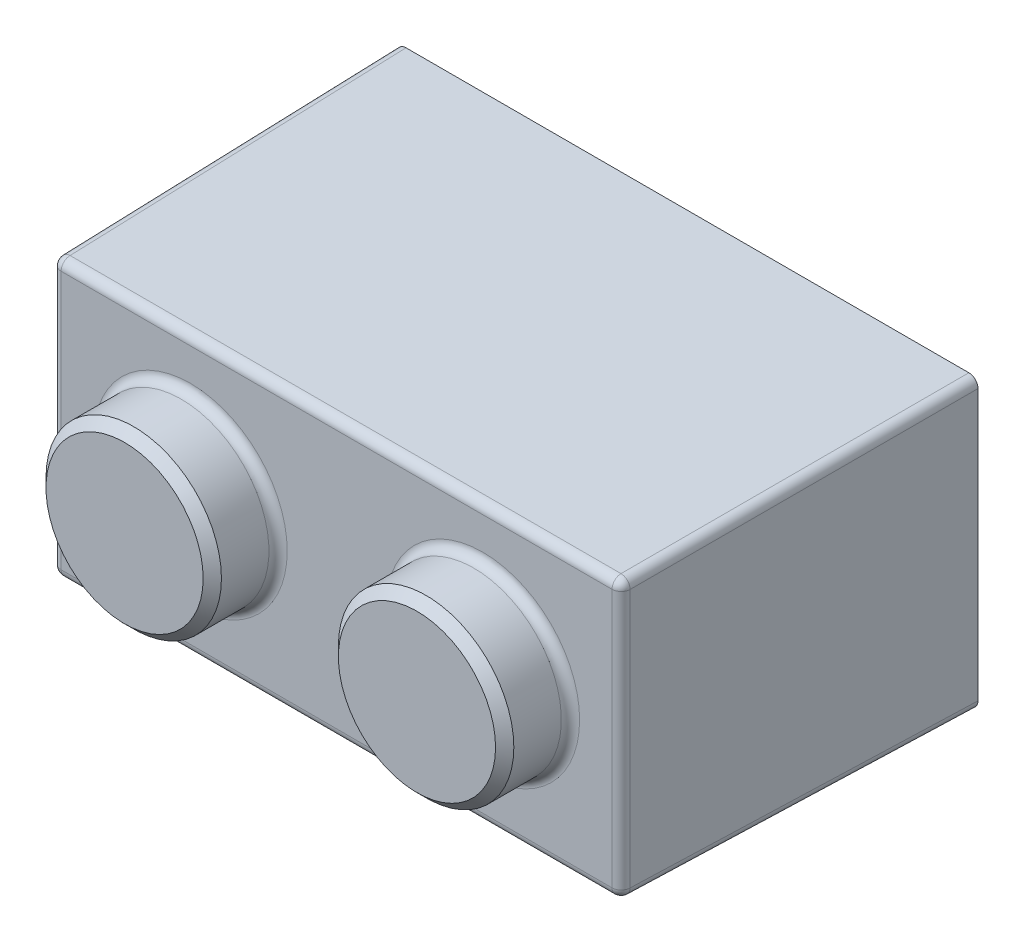
ISO-10303-21;
HEADER;
FILE_DESCRIPTION(('STEP AP214'),'2;1');
FILE_NAME('part.step','',(''),(''),'','','');
FILE_SCHEMA(('AUTOMOTIVE_DESIGN { 1 0 10303 214 1 1 1 1 }'));
ENDSEC;
DATA;
#1=APPLICATION_CONTEXT('core data for automotive mechanical design processes');
#2=APPLICATION_PROTOCOL_DEFINITION('international standard','automotive_design',2000,#1);
#3=PRODUCT_CONTEXT('',#1,'mechanical');
#4=PRODUCT('Part','Part','',(#3));
#5=PRODUCT_RELATED_PRODUCT_CATEGORY('part','',(#4));
#6=PRODUCT_DEFINITION_FORMATION('','',#4);
#7=PRODUCT_DEFINITION_CONTEXT('part definition',#1,'design');
#8=PRODUCT_DEFINITION('design','',#6,#7);
#9=PRODUCT_DEFINITION_SHAPE('','',#8);
#10=(LENGTH_UNIT() NAMED_UNIT(*) SI_UNIT(.MILLI.,.METRE.));
#11=(NAMED_UNIT(*) PLANE_ANGLE_UNIT() SI_UNIT($,.RADIAN.));
#12=(NAMED_UNIT(*) SI_UNIT($,.STERADIAN.) SOLID_ANGLE_UNIT());
#13=UNCERTAINTY_MEASURE_WITH_UNIT(LENGTH_MEASURE(1.E-05),#10,'distance_accuracy_value','');
#14=(GEOMETRIC_REPRESENTATION_CONTEXT(3) GLOBAL_UNCERTAINTY_ASSIGNED_CONTEXT((#13)) GLOBAL_UNIT_ASSIGNED_CONTEXT((#10,
#11,#12)) REPRESENTATION_CONTEXT('',''));
#15=CARTESIAN_POINT('',(0.,0.,0.));
#16=DIRECTION('',(0.,0.,1.));
#17=DIRECTION('',(1.,0.,0.));
#18=AXIS2_PLACEMENT_3D('',#15,#16,#17);
#19=CARTESIAN_POINT('',(0.,0.,0.));
#20=DIRECTION('',(0.,0.,-1.));
#21=DIRECTION('',(-1.,0.,0.));
#22=AXIS2_PLACEMENT_3D('',#19,#20,#21);
#23=PLANE('',#22);
#24=DIRECTION('',(-1.,0.,0.));
#25=VECTOR('',#24,1.);
#26=CARTESIAN_POINT('',(0.,7.9,0.));
#27=LINE('',#26,#25);
#28=CARTESIAN_POINT('',(15.6500380762109,7.9,0.));
#29=VERTEX_POINT('',#28);
#30=CARTESIAN_POINT('',(0.249961923789098,7.9,0.));
#31=VERTEX_POINT('',#30);
#32=EDGE_CURVE('E230',#29,#31,#27,.T.);
#33=ORIENTED_EDGE('',*,*,#32,.F.);
#34=CARTESIAN_POINT('',(15.649961917989,7.64996191798902,0.));
#35=DIRECTION('',(0.,0.,-1.));
#36=DIRECTION('',(0.707106781186548,0.707106781186548,0.));
#37=AXIS2_PLACEMENT_3D('',#34,#35,#36);
#38=ELLIPSE('',#37,0.250076158222762,0.25);
#39=CARTESIAN_POINT('',(15.9,7.6500380762109,0.));
#40=VERTEX_POINT('',#39);
#41=EDGE_CURVE('E307',#29,#40,#38,.T.);
#42=ORIENTED_EDGE('',*,*,#41,.T.);
#43=DIRECTION('',(0.,1.,0.));
#44=VECTOR('',#43,1.);
#45=CARTESIAN_POINT('',(15.9,0.,0.));
#46=LINE('',#45,#44);
#47=CARTESIAN_POINT('',(15.9,0.249961923789098,0.));
#48=VERTEX_POINT('',#47);
#49=EDGE_CURVE('E226',#48,#40,#46,.T.);
#50=ORIENTED_EDGE('',*,*,#49,.F.);
#51=CARTESIAN_POINT('',(15.649961917989,0.250038082010977,0.));
#52=DIRECTION('',(0.,0.,-1.));
#53=DIRECTION('',(0.707106781186548,-0.707106781186548,0.));
#54=AXIS2_PLACEMENT_3D('',#51,#52,#53);
#55=ELLIPSE('',#54,0.250076158222762,0.25);
#56=CARTESIAN_POINT('',(15.6500380762109,0.,0.));
#57=VERTEX_POINT('',#56);
#58=EDGE_CURVE('E304',#48,#57,#55,.T.);
#59=ORIENTED_EDGE('',*,*,#58,.T.);
#60=DIRECTION('',(1.,0.,0.));
#61=VECTOR('',#60,1.);
#62=CARTESIAN_POINT('',(0.,0.,0.));
#63=LINE('',#62,#61);
#64=CARTESIAN_POINT('',(0.249961923789098,0.,0.));
#65=VERTEX_POINT('',#64);
#66=EDGE_CURVE('E222',#65,#57,#63,.T.);
#67=ORIENTED_EDGE('',*,*,#66,.F.);
#68=CARTESIAN_POINT('',(0.250038082010977,0.250038082010977,0.));
#69=DIRECTION('',(0.,0.,-1.));
#70=DIRECTION('',(-0.707106781186548,-0.707106781186548,0.));
#71=AXIS2_PLACEMENT_3D('',#68,#69,#70);
#72=ELLIPSE('',#71,0.250076158222762,0.25);
#73=CARTESIAN_POINT('',(0.,0.249961923789098,0.));
#74=VERTEX_POINT('',#73);
#75=EDGE_CURVE('E298',#65,#74,#72,.T.);
#76=ORIENTED_EDGE('',*,*,#75,.T.);
#77=DIRECTION('',(0.,-1.,0.));
#78=VECTOR('',#77,1.);
#79=CARTESIAN_POINT('',(0.,0.,0.));
#80=LINE('',#79,#78);
#81=CARTESIAN_POINT('',(0.,7.6500380762109,0.));
#82=VERTEX_POINT('',#81);
#83=EDGE_CURVE('E197',#82,#74,#80,.T.);
#84=ORIENTED_EDGE('',*,*,#83,.F.);
#85=CARTESIAN_POINT('',(0.250038082010977,7.64996191798902,0.));
#86=DIRECTION('',(0.,0.,-1.));
#87=DIRECTION('',(-0.707106781186548,0.707106781186548,0.));
#88=AXIS2_PLACEMENT_3D('',#85,#86,#87);
#89=ELLIPSE('',#88,0.250076158222762,0.25);
#90=EDGE_CURVE('E301',#82,#31,#89,.T.);
#91=ORIENTED_EDGE('',*,*,#90,.T.);
#92=EDGE_LOOP('',(#33,#42,#50,#59,#67,#76,#84,#91));
#93=FACE_BOUND('',#92,.T.);
#94=DIRECTION('',(1.,0.,0.));
#95=VECTOR('',#94,1.);
#96=CARTESIAN_POINT('',(0.,6.69981720634731,0.));
#97=LINE('',#96,#95);
#98=CARTESIAN_POINT('',(14.6998172063473,6.69981720634731,0.));
#99=VERTEX_POINT('',#98);
#100=CARTESIAN_POINT('',(1.20018279365269,6.69981720634731,0.));
#101=VERTEX_POINT('',#100);
#102=EDGE_CURVE('E168',#99,#101,#97,.F.);
#103=ORIENTED_EDGE('',*,*,#102,.T.);
#104=DIRECTION('',(0.,1.,0.));
#105=VECTOR('',#104,1.);
#106=CARTESIAN_POINT('',(1.20018279365269,0.,0.));
#107=LINE('',#106,#105);
#108=CARTESIAN_POINT('',(1.20018279365269,1.20018279365269,0.));
#109=VERTEX_POINT('',#108);
#110=EDGE_CURVE('E203',#101,#109,#107,.F.);
#111=ORIENTED_EDGE('',*,*,#110,.T.);
#112=DIRECTION('',(-1.,0.,0.));
#113=VECTOR('',#112,1.);
#114=CARTESIAN_POINT('',(0.,1.20018279365269,0.));
#115=LINE('',#114,#113);
#116=CARTESIAN_POINT('',(14.6998172063473,1.20018279365269,0.));
#117=VERTEX_POINT('',#116);
#118=EDGE_CURVE('E172',#109,#117,#115,.F.);
#119=ORIENTED_EDGE('',*,*,#118,.T.);
#120=DIRECTION('',(0.,-1.,0.));
#121=VECTOR('',#120,1.);
#122=CARTESIAN_POINT('',(14.6998172063473,0.,0.));
#123=LINE('',#122,#121);
#124=EDGE_CURVE('E214',#117,#99,#123,.F.);
#125=ORIENTED_EDGE('',*,*,#124,.T.);
#126=EDGE_LOOP('',(#103,#111,#119,#125));
#127=FACE_BOUND('',#126,.T.);
#128=ADVANCED_FACE('F44',(#93,#127),#23,.T.);
#129=CARTESIAN_POINT('',(0.,0.,0.));
#130=DIRECTION('',(-0.999847695156391,0.,0.0174524064372835));
#131=DIRECTION('',(0.0174524064372835,0.,0.999847695156391));
#132=AXIS2_PLACEMENT_3D('',#129,#130,#131);
#133=PLANE('',#132);
#134=DIRECTION('',(0.,-1.,0.));
#135=VECTOR('',#134,1.);
#136=CARTESIAN_POINT('',(0.163281015300714,0.,9.35436310160932));
#137=LINE('',#136,#135);
#138=CARTESIAN_POINT('',(0.163281015300714,0.413242939089812,9.35436310160932));
#139=VERTEX_POINT('',#138);
#140=CARTESIAN_POINT('',(0.163281015300714,7.48675706091019,9.35436310160932));
#141=VERTEX_POINT('',#140);
#142=EDGE_CURVE('E61',#139,#141,#137,.F.);
#143=ORIENTED_EDGE('',*,*,#142,.T.);
#144=DIRECTION('',(0.0174497491606827,-0.0174497491606827,0.999695459881888));
#145=VECTOR('',#144,1.);
#146=CARTESIAN_POINT('',(0.0023293887491143,7.64770868746179,0.133450592059881));
#147=LINE('',#146,#145);
#148=EDGE_CURVE('E287',#141,#82,#147,.F.);
#149=ORIENTED_EDGE('',*,*,#148,.T.);
#150=ORIENTED_EDGE('',*,*,#83,.T.);
#151=DIRECTION('',(0.0174497491606827,0.0174497491606827,0.999695459881888));
#152=VECTOR('',#151,1.);
#153=CARTESIAN_POINT('',(-7.61118424746045E-05,0.249885811946623,-0.00436044453501649));
#154=LINE('',#153,#152);
#155=EDGE_CURVE('E66',#74,#139,#154,.T.);
#156=ORIENTED_EDGE('',*,*,#155,.T.);
#157=EDGE_LOOP('',(#143,#149,#150,#156));
#158=FACE_BOUND('',#157,.T.);
#159=ADVANCED_FACE('F379',(#158),#133,.T.);
#160=CARTESIAN_POINT('',(0.,0.,0.));
#161=DIRECTION('',(0.,-0.999847695156391,0.0174524064372835));
#162=DIRECTION('',(0.,-0.0174524064372835,-0.999847695156391));
#163=AXIS2_PLACEMENT_3D('',#160,#161,#162);
#164=PLANE('',#163);
#165=ORIENTED_EDGE('',*,*,#66,.T.);
#166=DIRECTION('',(-0.0174497491606827,0.0174497491606827,0.999695459881888));
#167=VECTOR('',#166,1.);
#168=CARTESIAN_POINT('',(15.6452727374956,0.00476533871528028,0.273006072155979));
#169=LINE('',#168,#167);
#170=CARTESIAN_POINT('',(15.4867570609102,0.163281015300714,9.35436310160932));
#171=VERTEX_POINT('',#170);
#172=EDGE_CURVE('E280',#57,#171,#169,.T.);
#173=ORIENTED_EDGE('',*,*,#172,.T.);
#174=DIRECTION('',(1.,0.,0.));
#175=VECTOR('',#174,1.);
#176=CARTESIAN_POINT('',(0.,0.163281015300714,9.35436310160932));
#177=LINE('',#176,#175);
#178=CARTESIAN_POINT('',(0.413242939089812,0.163281015300714,9.35436310160932));
#179=VERTEX_POINT('',#178);
#180=EDGE_CURVE('E277',#171,#179,#177,.F.);
#181=ORIENTED_EDGE('',*,*,#180,.T.);
#182=DIRECTION('',(0.0174497491606827,0.0174497491606827,0.999695459881888));
#183=VECTOR('',#182,1.);
#184=CARTESIAN_POINT('',(0.249885811946623,-7.61118424746045E-05,-0.00436044453501649));
#185=LINE('',#184,#183);
#186=EDGE_CURVE('E274',#179,#65,#185,.F.);
#187=ORIENTED_EDGE('',*,*,#186,.T.);
#188=EDGE_LOOP('',(#165,#173,#181,#187));
#189=FACE_BOUND('',#188,.T.);
#190=ADVANCED_FACE('F385',(#189),#164,.T.);
#191=CARTESIAN_POINT('',(15.9,0.,0.));
#192=DIRECTION('',(0.999847695156391,0.,0.0174524064372835));
#193=DIRECTION('',(0.0174524064372835,0.,-0.999847695156391));
#194=AXIS2_PLACEMENT_3D('',#191,#192,#193);
#195=PLANE('',#194);
#196=ORIENTED_EDGE('',*,*,#49,.T.);
#197=DIRECTION('',(-0.0174497491606827,-0.0174497491606827,0.999695459881888));
#198=VECTOR('',#197,1.);
#199=CARTESIAN_POINT('',(15.8976706112509,7.64770868746179,0.133450592059881));
#200=LINE('',#199,#198);
#201=CARTESIAN_POINT('',(15.7367189846993,7.48675706091019,9.35436310160932));
#202=VERTEX_POINT('',#201);
#203=EDGE_CURVE('E271',#40,#202,#200,.T.);
#204=ORIENTED_EDGE('',*,*,#203,.T.);
#205=DIRECTION('',(0.,1.,0.));
#206=VECTOR('',#205,1.);
#207=CARTESIAN_POINT('',(15.7367189846993,0.,9.35436310160932));
#208=LINE('',#207,#206);
#209=CARTESIAN_POINT('',(15.7367189846993,0.413242939089812,9.35436310160932));
#210=VERTEX_POINT('',#209);
#211=EDGE_CURVE('E268',#202,#210,#208,.F.);
#212=ORIENTED_EDGE('',*,*,#211,.T.);
#213=DIRECTION('',(-0.0174497491606827,0.0174497491606827,0.999695459881888));
#214=VECTOR('',#213,1.);
#215=CARTESIAN_POINT('',(15.9000761118425,0.249885811946623,-0.00436044453501649));
#216=LINE('',#215,#214);
#217=EDGE_CURVE('E265',#210,#48,#216,.F.);
#218=ORIENTED_EDGE('',*,*,#217,.T.);
#219=EDGE_LOOP('',(#196,#204,#212,#218));
#220=FACE_BOUND('',#219,.T.);
#221=ADVANCED_FACE('F396',(#220),#195,.T.);
#222=CARTESIAN_POINT('',(0.,7.9,0.));
#223=DIRECTION('',(0.,0.999847695156391,0.0174524064372835));
#224=DIRECTION('',(0.,-0.0174524064372835,0.999847695156391));
#225=AXIS2_PLACEMENT_3D('',#222,#223,#224);
#226=PLANE('',#225);
#227=DIRECTION('',(-1.,0.,0.));
#228=VECTOR('',#227,1.);
#229=CARTESIAN_POINT('',(0.,7.73671898469929,9.35436310160932));
#230=LINE('',#229,#228);
#231=CARTESIAN_POINT('',(0.413242939089812,7.73671898469929,9.35436310160932));
#232=VERTEX_POINT('',#231);
#233=CARTESIAN_POINT('',(15.4867570609102,7.73671898469929,9.35436310160932));
#234=VERTEX_POINT('',#233);
#235=EDGE_CURVE('E258',#232,#234,#230,.F.);
#236=ORIENTED_EDGE('',*,*,#235,.T.);
#237=DIRECTION('',(-0.0174497491606827,-0.0174497491606827,0.999695459881888));
#238=VECTOR('',#237,1.);
#239=CARTESIAN_POINT('',(15.6452727374956,7.89523466128472,0.273006072155979));
#240=LINE('',#239,#238);
#241=EDGE_CURVE('E262',#234,#29,#240,.F.);
#242=ORIENTED_EDGE('',*,*,#241,.T.);
#243=ORIENTED_EDGE('',*,*,#32,.T.);
#244=DIRECTION('',(0.0174497491606827,-0.0174497491606827,0.999695459881888));
#245=VECTOR('',#244,1.);
#246=CARTESIAN_POINT('',(0.249885811946623,7.90007611184248,-0.00436044453501649));
#247=LINE('',#246,#245);
#248=EDGE_CURVE('E255',#31,#232,#247,.T.);
#249=ORIENTED_EDGE('',*,*,#248,.T.);
#250=EDGE_LOOP('',(#236,#242,#243,#249));
#251=FACE_BOUND('',#250,.T.);
#252=ADVANCED_FACE('F393',(#251),#226,.T.);
#253=CARTESIAN_POINT('',(0.,0.,9.6));
#254=DIRECTION('',(0.,0.,-1.));
#255=DIRECTION('',(-1.,0.,0.));
#256=AXIS2_PLACEMENT_3D('',#253,#254,#255);
#257=PLANE('',#256);
#258=DIRECTION('',(0.,-1.,0.));
#259=VECTOR('',#258,1.);
#260=CARTESIAN_POINT('',(15.4867570609102,0.,9.6));
#261=LINE('',#260,#259);
#262=CARTESIAN_POINT('',(15.4867570609102,0.413242939089812,9.6));
#263=VERTEX_POINT('',#262);
#264=CARTESIAN_POINT('',(15.4867570609102,7.48675706091019,9.6));
#265=VERTEX_POINT('',#264);
#266=EDGE_CURVE('E248',#263,#265,#261,.F.);
#267=ORIENTED_EDGE('',*,*,#266,.T.);
#268=DIRECTION('',(1.,0.,0.));
#269=VECTOR('',#268,1.);
#270=CARTESIAN_POINT('',(0.,7.48675706091019,9.6));
#271=LINE('',#270,#269);
#272=CARTESIAN_POINT('',(0.413242939089812,7.48675706091019,9.6));
#273=VERTEX_POINT('',#272);
#274=EDGE_CURVE('E251',#265,#273,#271,.F.);
#275=ORIENTED_EDGE('',*,*,#274,.T.);
#276=DIRECTION('',(0.,1.,0.));
#277=VECTOR('',#276,1.);
#278=CARTESIAN_POINT('',(0.413242939089812,0.,9.6));
#279=LINE('',#278,#277);
#280=CARTESIAN_POINT('',(0.413242939089812,0.413242939089812,9.6));
#281=VERTEX_POINT('',#280);
#282=EDGE_CURVE('E242',#273,#281,#279,.F.);
#283=ORIENTED_EDGE('',*,*,#282,.T.);
#284=DIRECTION('',(-1.,0.,0.));
#285=VECTOR('',#284,1.);
#286=CARTESIAN_POINT('',(0.,0.413242939089812,9.6));
#287=LINE('',#286,#285);
#288=EDGE_CURVE('E245',#281,#263,#287,.F.);
#289=ORIENTED_EDGE('',*,*,#288,.T.);
#290=EDGE_LOOP('',(#267,#275,#283,#289));
#291=FACE_BOUND('',#290,.T.);
#292=CARTESIAN_POINT('',(3.95,3.95,9.6));
#293=DIRECTION('',(0.,0.,-1.));
#294=DIRECTION('',(-1.,0.,0.));
#295=AXIS2_PLACEMENT_3D('',#292,#293,#294);
#296=CIRCLE('',#295,2.65);
#297=CARTESIAN_POINT('',(1.3,3.95,9.6));
#298=VERTEX_POINT('',#297);
#299=EDGE_CURVE('E238',#298,#298,#296,.T.);
#300=ORIENTED_EDGE('',*,*,#299,.T.);
#301=EDGE_LOOP('',(#300));
#302=FACE_BOUND('',#301,.T.);
#303=CARTESIAN_POINT('',(11.95,3.95,9.6));
#304=DIRECTION('',(0.,0.,-1.));
#305=DIRECTION('',(-1.,0.,0.));
#306=AXIS2_PLACEMENT_3D('',#303,#304,#305);
#307=CIRCLE('',#306,2.65);
#308=CARTESIAN_POINT('',(9.3,3.95,9.6));
#309=VERTEX_POINT('',#308);
#310=EDGE_CURVE('E234',#309,#309,#307,.T.);
#311=ORIENTED_EDGE('',*,*,#310,.T.);
#312=EDGE_LOOP('',(#311));
#313=FACE_BOUND('',#312,.T.);
#314=ADVANCED_FACE('F390',(#291,#302,#313),#257,.F.);
#315=CARTESIAN_POINT('',(3.95,3.95,11.4));
#316=DIRECTION('',(0.,0.,-1.));
#317=DIRECTION('',(-1.,0.,0.));
#318=AXIS2_PLACEMENT_3D('',#315,#316,#317);
#319=CYLINDRICAL_SURFACE('',#318,2.4);
#320=CARTESIAN_POINT('',(3.95,3.95,11.15));
#321=DIRECTION('',(0.,0.,1.));
#322=DIRECTION('',(1.,0.,0.));
#323=AXIS2_PLACEMENT_3D('',#320,#321,#322);
#324=CIRCLE('',#323,2.4);
#325=CARTESIAN_POINT('',(6.35,3.95,11.15));
#326=VERTEX_POINT('',#325);
#327=EDGE_CURVE('E359',#326,#326,#324,.F.);
#328=ORIENTED_EDGE('',*,*,#327,.T.);
#329=EDGE_LOOP('',(#328));
#330=FACE_BOUND('',#329,.T.);
#331=CARTESIAN_POINT('',(3.95,3.95,9.85));
#332=DIRECTION('',(0.,0.,-1.));
#333=DIRECTION('',(-1.,0.,0.));
#334=AXIS2_PLACEMENT_3D('',#331,#332,#333);
#335=CIRCLE('',#334,2.4);
#336=CARTESIAN_POINT('',(1.55,3.95,9.85));
#337=VERTEX_POINT('',#336);
#338=EDGE_CURVE('E290',#337,#337,#335,.F.);
#339=ORIENTED_EDGE('',*,*,#338,.T.);
#340=EDGE_LOOP('',(#339));
#341=FACE_BOUND('',#340,.T.);
#342=ADVANCED_FACE('F480',(#330,#341),#319,.T.);
#343=CARTESIAN_POINT('',(3.95,3.95,11.4));
#344=DIRECTION('',(0.,0.,1.));
#345=DIRECTION('',(1.,0.,0.));
#346=AXIS2_PLACEMENT_3D('',#343,#344,#345);
#347=PLANE('',#346);
#348=CARTESIAN_POINT('',(3.95,3.95,11.4));
#349=DIRECTION('',(0.,0.,1.));
#350=DIRECTION('',(1.,0.,0.));
#351=AXIS2_PLACEMENT_3D('',#348,#349,#350);
#352=CIRCLE('',#351,2.15);
#353=CARTESIAN_POINT('',(6.1,3.95,11.4));
#354=VERTEX_POINT('',#353);
#355=EDGE_CURVE('E310',#354,#354,#352,.T.);
#356=ORIENTED_EDGE('',*,*,#355,.T.);
#357=EDGE_LOOP('',(#356));
#358=FACE_BOUND('',#357,.T.);
#359=ADVANCED_FACE('F472',(#358),#347,.T.);
#360=CARTESIAN_POINT('',(11.95,3.95,11.4));
#361=DIRECTION('',(0.,0.,-1.));
#362=DIRECTION('',(-1.,0.,0.));
#363=AXIS2_PLACEMENT_3D('',#360,#361,#362);
#364=CYLINDRICAL_SURFACE('',#363,2.4);
#365=CARTESIAN_POINT('',(11.95,3.95,11.15));
#366=DIRECTION('',(0.,0.,1.));
#367=DIRECTION('',(1.,0.,0.));
#368=AXIS2_PLACEMENT_3D('',#365,#366,#367);
#369=CIRCLE('',#368,2.4);
#370=CARTESIAN_POINT('',(14.35,3.95,11.15));
#371=VERTEX_POINT('',#370);
#372=EDGE_CURVE('E11',#371,#371,#369,.F.);
#373=ORIENTED_EDGE('',*,*,#372,.T.);
#374=EDGE_LOOP('',(#373));
#375=FACE_BOUND('',#374,.T.);
#376=CARTESIAN_POINT('',(11.95,3.95,9.85));
#377=DIRECTION('',(0.,0.,-1.));
#378=DIRECTION('',(-1.,0.,0.));
#379=AXIS2_PLACEMENT_3D('',#376,#377,#378);
#380=CIRCLE('',#379,2.4);
#381=CARTESIAN_POINT('',(9.55,3.95,9.85));
#382=VERTEX_POINT('',#381);
#383=EDGE_CURVE('E294',#382,#382,#380,.F.);
#384=ORIENTED_EDGE('',*,*,#383,.T.);
#385=EDGE_LOOP('',(#384));
#386=FACE_BOUND('',#385,.T.);
#387=ADVANCED_FACE('F470',(#375,#386),#364,.T.);
#388=CARTESIAN_POINT('',(11.95,3.95,11.4));
#389=DIRECTION('',(0.,0.,1.));
#390=DIRECTION('',(1.,0.,0.));
#391=AXIS2_PLACEMENT_3D('',#388,#389,#390);
#392=PLANE('',#391);
#393=CARTESIAN_POINT('',(11.95,3.95,11.4));
#394=DIRECTION('',(0.,0.,1.));
#395=DIRECTION('',(1.,0.,0.));
#396=AXIS2_PLACEMENT_3D('',#393,#394,#395);
#397=CIRCLE('',#396,2.15);
#398=CARTESIAN_POINT('',(14.1,3.95,11.4));
#399=VERTEX_POINT('',#398);
#400=EDGE_CURVE('E54',#399,#399,#397,.T.);
#401=ORIENTED_EDGE('',*,*,#400,.T.);
#402=EDGE_LOOP('',(#401));
#403=FACE_BOUND('',#402,.T.);
#404=ADVANCED_FACE('F367',(#403),#392,.T.);
#405=CARTESIAN_POINT('',(1.19981723418767,0.,-0.0209428877247403));
#406=DIRECTION('',(-0.999847695156391,0.,0.0174524064372835));
#407=DIRECTION('',(0.0174524064372835,0.,0.999847695156391));
#408=AXIS2_PLACEMENT_3D('',#405,#406,#407);
#409=PLANE('',#408);
#410=ORIENTED_EDGE('',*,*,#110,.F.);
#411=DIRECTION('',(-0.0174497491606827,0.0174497491606827,-0.999695459881887));
#412=VECTOR('',#411,1.);
#413=CARTESIAN_POINT('',(1.20185739793538,6.69814260206462,0.0959380151020777));
#414=LINE('',#413,#412);
#415=CARTESIAN_POINT('',(1.34680533904972,6.55319466095028,8.4));
#416=VERTEX_POINT('',#415);
#417=EDGE_CURVE('E166',#416,#101,#414,.T.);
#418=ORIENTED_EDGE('',*,*,#417,.F.);
#419=DIRECTION('',(0.,1.,0.));
#420=VECTOR('',#419,1.);
#421=CARTESIAN_POINT('',(1.34680533904972,0.,8.4));
#422=LINE('',#421,#420);
#423=CARTESIAN_POINT('',(1.34680533904972,1.34680533904972,8.4));
#424=VERTEX_POINT('',#423);
#425=EDGE_CURVE('E151',#416,#424,#422,.F.);
#426=ORIENTED_EDGE('',*,*,#425,.T.);
#427=DIRECTION('',(-0.0174497491606827,-0.0174497491606827,-0.999695459881887));
#428=VECTOR('',#427,1.);
#429=CARTESIAN_POINT('',(1.19945189734379,1.19945189734379,-0.0418730214928194));
#430=LINE('',#429,#428);
#431=EDGE_CURVE('E164',#424,#109,#430,.T.);
#432=ORIENTED_EDGE('',*,*,#431,.T.);
#433=EDGE_LOOP('',(#410,#418,#426,#432));
#434=FACE_BOUND('',#433,.T.);
#435=ADVANCED_FACE('F163',(#434),#409,.F.);
#436=CARTESIAN_POINT('',(0.,1.19981723418767,-0.0209428877247403));
#437=DIRECTION('',(0.,-0.999847695156391,0.0174524064372835));
#438=DIRECTION('',(0.,-0.0174524064372835,-0.999847695156391));
#439=AXIS2_PLACEMENT_3D('',#436,#437,#438);
#440=PLANE('',#439);
#441=ORIENTED_EDGE('',*,*,#118,.F.);
#442=ORIENTED_EDGE('',*,*,#431,.F.);
#443=DIRECTION('',(-1.,0.,0.));
#444=VECTOR('',#443,1.);
#445=CARTESIAN_POINT('',(0.,1.34680533904972,8.4));
#446=LINE('',#445,#444);
#447=CARTESIAN_POINT('',(14.5531946609503,1.34680533904972,8.4));
#448=VERTEX_POINT('',#447);
#449=EDGE_CURVE('E147',#424,#448,#446,.F.);
#450=ORIENTED_EDGE('',*,*,#449,.T.);
#451=DIRECTION('',(0.0174497491606827,-0.0174497491606827,-0.999695459881887));
#452=VECTOR('',#451,1.);
#453=CARTESIAN_POINT('',(14.7005481026562,1.19945189734379,-0.0418730214928194));
#454=LINE('',#453,#452);
#455=EDGE_CURVE('E175',#448,#117,#454,.T.);
#456=ORIENTED_EDGE('',*,*,#455,.T.);
#457=EDGE_LOOP('',(#441,#442,#450,#456));
#458=FACE_BOUND('',#457,.T.);
#459=ADVANCED_FACE('F170',(#458),#440,.F.);
#460=CARTESIAN_POINT('',(14.7001827658123,0.,-0.0209428877247403));
#461=DIRECTION('',(0.999847695156391,0.,0.0174524064372835));
#462=DIRECTION('',(0.0174524064372835,0.,-0.999847695156391));
#463=AXIS2_PLACEMENT_3D('',#460,#461,#462);
#464=PLANE('',#463);
#465=ORIENTED_EDGE('',*,*,#124,.F.);
#466=ORIENTED_EDGE('',*,*,#455,.F.);
#467=DIRECTION('',(0.,-1.,0.));
#468=VECTOR('',#467,1.);
#469=CARTESIAN_POINT('',(14.5531946609503,0.,8.4));
#470=LINE('',#469,#468);
#471=CARTESIAN_POINT('',(14.5531946609503,6.55319466095028,8.4));
#472=VERTEX_POINT('',#471);
#473=EDGE_CURVE('E152',#448,#472,#470,.F.);
#474=ORIENTED_EDGE('',*,*,#473,.T.);
#475=DIRECTION('',(0.0174497491606827,0.0174497491606827,-0.999695459881887));
#476=VECTOR('',#475,1.);
#477=CARTESIAN_POINT('',(14.6957066520985,6.69570665209845,0.235493495198176));
#478=LINE('',#477,#476);
#479=EDGE_CURVE('E183',#472,#99,#478,.T.);
#480=ORIENTED_EDGE('',*,*,#479,.T.);
#481=EDGE_LOOP('',(#465,#466,#474,#480));
#482=FACE_BOUND('',#481,.T.);
#483=ADVANCED_FACE('F621',(#482),#464,.F.);
#484=CARTESIAN_POINT('',(0.,6.70018276581233,-0.0209428877247403));
#485=DIRECTION('',(0.,0.999847695156391,0.0174524064372835));
#486=DIRECTION('',(0.,-0.0174524064372835,0.999847695156391));
#487=AXIS2_PLACEMENT_3D('',#484,#485,#486);
#488=PLANE('',#487);
#489=ORIENTED_EDGE('',*,*,#102,.F.);
#490=ORIENTED_EDGE('',*,*,#479,.F.);
#491=DIRECTION('',(1.,0.,0.));
#492=VECTOR('',#491,1.);
#493=CARTESIAN_POINT('',(0.,6.55319466095028,8.4));
#494=LINE('',#493,#492);
#495=EDGE_CURVE('E187',#472,#416,#494,.F.);
#496=ORIENTED_EDGE('',*,*,#495,.T.);
#497=ORIENTED_EDGE('',*,*,#417,.T.);
#498=EDGE_LOOP('',(#489,#490,#496,#497));
#499=FACE_BOUND('',#498,.T.);
#500=ADVANCED_FACE('F610',(#499),#488,.F.);
#501=CARTESIAN_POINT('',(0.,0.,8.4));
#502=DIRECTION('',(0.,0.,-1.));
#503=DIRECTION('',(-1.,0.,0.));
#504=AXIS2_PLACEMENT_3D('',#501,#502,#503);
#505=PLANE('',#504);
#506=CARTESIAN_POINT('',(11.95,3.95,8.4));
#507=DIRECTION('',(0.,0.,-1.));
#508=DIRECTION('',(-1.,0.,0.));
#509=AXIS2_PLACEMENT_3D('',#506,#507,#508);
#510=CIRCLE('',#509,1.2);
#511=CARTESIAN_POINT('',(10.75,3.95,8.4));
#512=VERTEX_POINT('',#511);
#513=EDGE_CURVE('E181',#512,#512,#510,.F.);
#514=ORIENTED_EDGE('',*,*,#513,.T.);
#515=EDGE_LOOP('',(#514));
#516=FACE_BOUND('',#515,.T.);
#517=CARTESIAN_POINT('',(3.95,3.95,8.4));
#518=DIRECTION('',(0.,0.,-1.));
#519=DIRECTION('',(-1.,0.,0.));
#520=AXIS2_PLACEMENT_3D('',#517,#518,#519);
#521=CIRCLE('',#520,1.2);
#522=CARTESIAN_POINT('',(2.75,3.95,8.4));
#523=VERTEX_POINT('',#522);
#524=EDGE_CURVE('E174',#523,#523,#521,.F.);
#525=ORIENTED_EDGE('',*,*,#524,.T.);
#526=EDGE_LOOP('',(#525));
#527=FACE_BOUND('',#526,.T.);
#528=ORIENTED_EDGE('',*,*,#425,.F.);
#529=ORIENTED_EDGE('',*,*,#495,.F.);
#530=ORIENTED_EDGE('',*,*,#473,.F.);
#531=ORIENTED_EDGE('',*,*,#449,.F.);
#532=EDGE_LOOP('',(#528,#529,#530,#531));
#533=FACE_BOUND('',#532,.T.);
#534=ADVANCED_FACE('F149',(#516,#527,#533),#505,.T.);
#535=CARTESIAN_POINT('',(3.95,3.95,11.4));
#536=DIRECTION('',(0.,0.,-1.));
#537=DIRECTION('',(-1.,0.,0.));
#538=AXIS2_PLACEMENT_3D('',#535,#536,#537);
#539=CYLINDRICAL_SURFACE('',#538,1.2);
#540=CARTESIAN_POINT('',(3.95,3.95,10.2));
#541=DIRECTION('',(0.,0.,1.));
#542=DIRECTION('',(1.,0.,0.));
#543=AXIS2_PLACEMENT_3D('',#540,#541,#542);
#544=CIRCLE('',#543,1.2);
#545=CARTESIAN_POINT('',(5.15,3.95,10.2));
#546=VERTEX_POINT('',#545);
#547=EDGE_CURVE('E199',#546,#546,#544,.T.);
#548=ORIENTED_EDGE('',*,*,#547,.T.);
#549=EDGE_LOOP('',(#548));
#550=FACE_BOUND('',#549,.T.);
#551=ORIENTED_EDGE('',*,*,#524,.F.);
#552=EDGE_LOOP('',(#551));
#553=FACE_BOUND('',#552,.T.);
#554=ADVANCED_FACE('F589',(#550,#553),#539,.F.);
#555=CARTESIAN_POINT('',(3.95,3.95,10.2));
#556=DIRECTION('',(0.,0.,1.));
#557=DIRECTION('',(1.,0.,0.));
#558=AXIS2_PLACEMENT_3D('',#555,#556,#557);
#559=PLANE('',#558);
#560=ORIENTED_EDGE('',*,*,#547,.F.);
#561=EDGE_LOOP('',(#560));
#562=FACE_BOUND('',#561,.T.);
#563=ADVANCED_FACE('F578',(#562),#559,.F.);
#564=CARTESIAN_POINT('',(11.95,3.95,11.4));
#565=DIRECTION('',(0.,0.,-1.));
#566=DIRECTION('',(-1.,0.,0.));
#567=AXIS2_PLACEMENT_3D('',#564,#565,#566);
#568=CYLINDRICAL_SURFACE('',#567,1.2);
#569=CARTESIAN_POINT('',(11.95,3.95,10.2));
#570=DIRECTION('',(0.,0.,1.));
#571=DIRECTION('',(1.,0.,0.));
#572=AXIS2_PLACEMENT_3D('',#569,#570,#571);
#573=CIRCLE('',#572,1.2);
#574=CARTESIAN_POINT('',(13.15,3.95,10.2));
#575=VERTEX_POINT('',#574);
#576=EDGE_CURVE('E204',#575,#575,#573,.T.);
#577=ORIENTED_EDGE('',*,*,#576,.T.);
#578=EDGE_LOOP('',(#577));
#579=FACE_BOUND('',#578,.T.);
#580=ORIENTED_EDGE('',*,*,#513,.F.);
#581=EDGE_LOOP('',(#580));
#582=FACE_BOUND('',#581,.T.);
#583=ADVANCED_FACE('F566',(#579,#582),#568,.F.);
#584=CARTESIAN_POINT('',(11.95,3.95,10.2));
#585=DIRECTION('',(0.,0.,1.));
#586=DIRECTION('',(1.,0.,0.));
#587=AXIS2_PLACEMENT_3D('',#584,#585,#586);
#588=PLANE('',#587);
#589=ORIENTED_EDGE('',*,*,#576,.F.);
#590=EDGE_LOOP('',(#589));
#591=FACE_BOUND('',#590,.T.);
#592=ADVANCED_FACE('F452',(#591),#588,.F.);
#593=CARTESIAN_POINT('',(15.6501141880534,0.249885811946623,-0.00872354614433737));
#594=DIRECTION('',(0.0174497491606827,-0.0174497491606827,-0.999695459881887));
#595=DIRECTION('',(-0.999847695156391,0.,-0.0174524064372835));
#596=AXIS2_PLACEMENT_3D('',#593,#594,#595);
#597=CYLINDRICAL_SURFACE('',#596,0.25);
#598=ORIENTED_EDGE('',*,*,#58,.F.);
#599=ORIENTED_EDGE('',*,*,#217,.F.);
#600=CARTESIAN_POINT('',(15.4867570609102,0.413242939089812,9.35));
#601=DIRECTION('',(-0.01744974916068,0.01744974916068,0.999695459881888));
#602=DIRECTION('',(0.999847695156391,0.,0.0174524064372808));
#603=AXIS2_PLACEMENT_3D('',#600,#601,#602);
#604=CIRCLE('',#603,0.25);
#605=EDGE_CURVE('E208',#171,#210,#604,.T.);
#606=ORIENTED_EDGE('',*,*,#605,.F.);
#607=ORIENTED_EDGE('',*,*,#172,.F.);
#608=EDGE_LOOP('',(#598,#599,#606,#607));
#609=FACE_BOUND('',#608,.T.);
#610=ADVANCED_FACE('F448',(#609),#597,.T.);
#611=CARTESIAN_POINT('',(0.,0.413242939089812,9.35));
#612=DIRECTION('',(-1.,0.,0.));
#613=DIRECTION('',(0.,0.,1.));
#614=AXIS2_PLACEMENT_3D('',#611,#612,#613);
#615=CYLINDRICAL_SURFACE('',#614,0.25);
#616=CARTESIAN_POINT('',(0.413242939089812,0.413242939089812,9.35));
#617=DIRECTION('',(-1.,0.,0.));
#618=DIRECTION('',(0.,0.,1.));
#619=AXIS2_PLACEMENT_3D('',#616,#617,#618);
#620=CIRCLE('',#619,0.25);
#621=EDGE_CURVE('E345',#179,#281,#620,.T.);
#622=ORIENTED_EDGE('',*,*,#621,.F.);
#623=ORIENTED_EDGE('',*,*,#180,.F.);
#624=CARTESIAN_POINT('',(15.4867570609102,0.413242939089812,9.35));
#625=DIRECTION('',(1.,0.,0.));
#626=DIRECTION('',(0.,0.,-1.));
#627=AXIS2_PLACEMENT_3D('',#624,#625,#626);
#628=CIRCLE('',#627,0.25);
#629=EDGE_CURVE('E349',#263,#171,#628,.T.);
#630=ORIENTED_EDGE('',*,*,#629,.F.);
#631=ORIENTED_EDGE('',*,*,#288,.F.);
#632=EDGE_LOOP('',(#622,#623,#630,#631));
#633=FACE_BOUND('',#632,.T.);
#634=ADVANCED_FACE('F444',(#633),#615,.T.);
#635=CARTESIAN_POINT('',(0.249885811946623,0.249885811946623,-0.00872354614433737));
#636=DIRECTION('',(-0.0174497491606827,-0.0174497491606827,-0.999695459881887));
#637=DIRECTION('',(-0.999847695156391,0.,0.0174524064372835));
#638=AXIS2_PLACEMENT_3D('',#635,#636,#637);
#639=CYLINDRICAL_SURFACE('',#638,0.25);
#640=ORIENTED_EDGE('',*,*,#75,.F.);
#641=ORIENTED_EDGE('',*,*,#186,.F.);
#642=CARTESIAN_POINT('',(0.413242939089812,0.413242939089812,9.35));
#643=DIRECTION('',(0.01744974916068,0.01744974916068,0.999695459881888));
#644=DIRECTION('',(0.999847695156391,0.,-0.0174524064372808));
#645=AXIS2_PLACEMENT_3D('',#642,#643,#644);
#646=CIRCLE('',#645,0.25);
#647=EDGE_CURVE('E341',#139,#179,#646,.T.);
#648=ORIENTED_EDGE('',*,*,#647,.F.);
#649=ORIENTED_EDGE('',*,*,#155,.F.);
#650=EDGE_LOOP('',(#640,#641,#648,#649));
#651=FACE_BOUND('',#650,.T.);
#652=ADVANCED_FACE('F440',(#651),#639,.T.);
#653=CARTESIAN_POINT('',(15.4867570609102,0.413242939089812,9.35));
#654=DIRECTION('',(0.,0.,1.));
#655=DIRECTION('',(0.,-1.,0.));
#656=AXIS2_PLACEMENT_3D('',#653,#654,#655);
#657=SPHERICAL_SURFACE('',#656,0.25);
#658=ORIENTED_EDGE('',*,*,#629,.T.);
#659=ORIENTED_EDGE('',*,*,#605,.T.);
#660=CARTESIAN_POINT('',(15.4867570609102,0.413242939089812,9.35));
#661=DIRECTION('',(0.,-1.,0.));
#662=DIRECTION('',(0.,0.,-1.));
#663=AXIS2_PLACEMENT_3D('',#660,#661,#662);
#664=CIRCLE('',#663,0.25);
#665=EDGE_CURVE('E337',#263,#210,#664,.F.);
#666=ORIENTED_EDGE('',*,*,#665,.F.);
#667=EDGE_LOOP('',(#658,#659,#666));
#668=FACE_BOUND('',#667,.T.);
#669=ADVANCED_FACE('F436',(#668),#657,.T.);
#670=CARTESIAN_POINT('',(0.413242939089812,0.413242939089812,9.35));
#671=DIRECTION('',(0.,0.,1.));
#672=DIRECTION('',(1.,0.,0.));
#673=AXIS2_PLACEMENT_3D('',#670,#671,#672);
#674=SPHERICAL_SURFACE('',#673,0.25);
#675=ORIENTED_EDGE('',*,*,#647,.T.);
#676=ORIENTED_EDGE('',*,*,#621,.T.);
#677=CARTESIAN_POINT('',(0.413242939089812,0.413242939089812,9.35));
#678=DIRECTION('',(0.,-1.,0.));
#679=DIRECTION('',(0.,0.,-1.));
#680=AXIS2_PLACEMENT_3D('',#677,#678,#679);
#681=CIRCLE('',#680,0.25);
#682=EDGE_CURVE('E333',#139,#281,#681,.F.);
#683=ORIENTED_EDGE('',*,*,#682,.F.);
#684=EDGE_LOOP('',(#675,#676,#683));
#685=FACE_BOUND('',#684,.T.);
#686=ADVANCED_FACE('F432',(#685),#674,.T.);
#687=CARTESIAN_POINT('',(15.6452727374956,7.64527273749562,0.268642970546658));
#688=DIRECTION('',(0.0174497491606827,0.0174497491606827,-0.999695459881887));
#689=DIRECTION('',(-0.999847695156391,0.,-0.0174524064372835));
#690=AXIS2_PLACEMENT_3D('',#687,#688,#689);
#691=CYLINDRICAL_SURFACE('',#690,0.25);
#692=ORIENTED_EDGE('',*,*,#41,.F.);
#693=ORIENTED_EDGE('',*,*,#241,.F.);
#694=CARTESIAN_POINT('',(15.4867570609102,7.48675706091019,9.35));
#695=DIRECTION('',(-0.01744974916068,-0.0174497491606797,0.999695459881887));
#696=DIRECTION('',(0.999847695156391,0.,0.0174524064372808));
#697=AXIS2_PLACEMENT_3D('',#694,#695,#696);
#698=CIRCLE('',#697,0.25);
#699=EDGE_CURVE('E329',#202,#234,#698,.T.);
#700=ORIENTED_EDGE('',*,*,#699,.F.);
#701=ORIENTED_EDGE('',*,*,#203,.F.);
#702=EDGE_LOOP('',(#692,#693,#700,#701));
#703=FACE_BOUND('',#702,.T.);
#704=ADVANCED_FACE('F428',(#703),#691,.T.);
#705=CARTESIAN_POINT('',(15.4867570609102,0.,9.35));
#706=DIRECTION('',(0.,-1.,0.));
#707=DIRECTION('',(0.,0.,-1.));
#708=AXIS2_PLACEMENT_3D('',#705,#706,#707);
#709=CYLINDRICAL_SURFACE('',#708,0.25);
#710=ORIENTED_EDGE('',*,*,#665,.T.);
#711=ORIENTED_EDGE('',*,*,#211,.F.);
#712=CARTESIAN_POINT('',(15.4867570609102,7.48675706091019,9.35));
#713=DIRECTION('',(0.,1.,0.));
#714=DIRECTION('',(-1.,0.,0.));
#715=AXIS2_PLACEMENT_3D('',#712,#713,#714);
#716=CIRCLE('',#715,0.25);
#717=EDGE_CURVE('E325',#265,#202,#716,.T.);
#718=ORIENTED_EDGE('',*,*,#717,.F.);
#719=ORIENTED_EDGE('',*,*,#266,.F.);
#720=EDGE_LOOP('',(#710,#711,#718,#719));
#721=FACE_BOUND('',#720,.T.);
#722=ADVANCED_FACE('F424',(#721),#709,.T.);
#723=CARTESIAN_POINT('',(0.413242939089812,0.,9.35));
#724=DIRECTION('',(0.,1.,0.));
#725=DIRECTION('',(0.,0.,1.));
#726=AXIS2_PLACEMENT_3D('',#723,#724,#725);
#727=CYLINDRICAL_SURFACE('',#726,0.25);
#728=ORIENTED_EDGE('',*,*,#682,.T.);
#729=ORIENTED_EDGE('',*,*,#282,.F.);
#730=CARTESIAN_POINT('',(0.413242939089812,7.48675706091019,9.35));
#731=DIRECTION('',(0.,1.,0.));
#732=DIRECTION('',(0.,0.,1.));
#733=AXIS2_PLACEMENT_3D('',#730,#731,#732);
#734=CIRCLE('',#733,0.25);
#735=EDGE_CURVE('E321',#141,#273,#734,.T.);
#736=ORIENTED_EDGE('',*,*,#735,.F.);
#737=ORIENTED_EDGE('',*,*,#142,.F.);
#738=EDGE_LOOP('',(#728,#729,#736,#737));
#739=FACE_BOUND('',#738,.T.);
#740=ADVANCED_FACE('F420',(#739),#727,.T.);
#741=CARTESIAN_POINT('',(0.252291312538212,7.64770868746179,0.12908749045056));
#742=DIRECTION('',(-0.0174497491606827,0.0174497491606827,-0.999695459881887));
#743=DIRECTION('',(-0.999847695156391,0.,0.0174524064372835));
#744=AXIS2_PLACEMENT_3D('',#741,#742,#743);
#745=CYLINDRICAL_SURFACE('',#744,0.25);
#746=ORIENTED_EDGE('',*,*,#90,.F.);
#747=ORIENTED_EDGE('',*,*,#148,.F.);
#748=CARTESIAN_POINT('',(0.413242939089812,7.48675706091019,9.35));
#749=DIRECTION('',(0.01744974916068,-0.01744974916068,0.999695459881887));
#750=DIRECTION('',(0.999847695156391,0.,-0.0174524064372808));
#751=AXIS2_PLACEMENT_3D('',#748,#749,#750);
#752=CIRCLE('',#751,0.25);
#753=EDGE_CURVE('E317',#232,#141,#752,.T.);
#754=ORIENTED_EDGE('',*,*,#753,.F.);
#755=ORIENTED_EDGE('',*,*,#248,.F.);
#756=EDGE_LOOP('',(#746,#747,#754,#755));
#757=FACE_BOUND('',#756,.T.);
#758=ADVANCED_FACE('F416',(#757),#745,.T.);
#759=CARTESIAN_POINT('',(15.4867570609102,7.48675706091019,9.35));
#760=DIRECTION('',(0.,0.,1.));
#761=DIRECTION('',(0.,-1.,0.));
#762=AXIS2_PLACEMENT_3D('',#759,#760,#761);
#763=SPHERICAL_SURFACE('',#762,0.25);
#764=ORIENTED_EDGE('',*,*,#717,.T.);
#765=ORIENTED_EDGE('',*,*,#699,.T.);
#766=CARTESIAN_POINT('',(15.4867570609102,7.48675706091019,9.35));
#767=DIRECTION('',(1.,0.,0.));
#768=DIRECTION('',(0.,0.,-1.));
#769=AXIS2_PLACEMENT_3D('',#766,#767,#768);
#770=CIRCLE('',#769,0.25);
#771=EDGE_CURVE('E314',#265,#234,#770,.F.);
#772=ORIENTED_EDGE('',*,*,#771,.F.);
#773=EDGE_LOOP('',(#764,#765,#772));
#774=FACE_BOUND('',#773,.T.);
#775=ADVANCED_FACE('F412',(#774),#763,.T.);
#776=CARTESIAN_POINT('',(0.413242939089812,7.48675706091019,9.35));
#777=DIRECTION('',(0.,0.,1.));
#778=DIRECTION('',(0.,-1.,0.));
#779=AXIS2_PLACEMENT_3D('',#776,#777,#778);
#780=SPHERICAL_SURFACE('',#779,0.25);
#781=ORIENTED_EDGE('',*,*,#753,.T.);
#782=ORIENTED_EDGE('',*,*,#735,.T.);
#783=CARTESIAN_POINT('',(0.413242939089812,7.48675706091019,9.35));
#784=DIRECTION('',(-1.,0.,0.));
#785=DIRECTION('',(0.,0.,1.));
#786=AXIS2_PLACEMENT_3D('',#783,#784,#785);
#787=CIRCLE('',#786,0.25);
#788=EDGE_CURVE('E311',#232,#273,#787,.F.);
#789=ORIENTED_EDGE('',*,*,#788,.F.);
#790=EDGE_LOOP('',(#781,#782,#789));
#791=FACE_BOUND('',#790,.T.);
#792=ADVANCED_FACE('F408',(#791),#780,.T.);
#793=CARTESIAN_POINT('',(0.,7.48675706091019,9.35));
#794=DIRECTION('',(1.,0.,0.));
#795=DIRECTION('',(0.,0.,-1.));
#796=AXIS2_PLACEMENT_3D('',#793,#794,#795);
#797=CYLINDRICAL_SURFACE('',#796,0.25);
#798=ORIENTED_EDGE('',*,*,#771,.T.);
#799=ORIENTED_EDGE('',*,*,#235,.F.);
#800=ORIENTED_EDGE('',*,*,#788,.T.);
#801=ORIENTED_EDGE('',*,*,#274,.F.);
#802=EDGE_LOOP('',(#798,#799,#800,#801));
#803=FACE_BOUND('',#802,.T.);
#804=ADVANCED_FACE('F404',(#803),#797,.T.);
#805=CARTESIAN_POINT('',(3.95,3.95,9.85));
#806=DIRECTION('',(0.,0.,-1.));
#807=DIRECTION('',(-1.,0.,0.));
#808=AXIS2_PLACEMENT_3D('',#805,#806,#807);
#809=TOROIDAL_SURFACE('',#808,2.65,0.25);
#810=ORIENTED_EDGE('',*,*,#299,.F.);
#811=EDGE_LOOP('',(#810));
#812=FACE_BOUND('',#811,.T.);
#813=ORIENTED_EDGE('',*,*,#338,.F.);
#814=EDGE_LOOP('',(#813));
#815=FACE_BOUND('',#814,.T.);
#816=ADVANCED_FACE('F407',(#812,#815),#809,.F.);
#817=CARTESIAN_POINT('',(11.95,3.95,9.85));
#818=DIRECTION('',(0.,0.,-1.));
#819=DIRECTION('',(-1.,0.,0.));
#820=AXIS2_PLACEMENT_3D('',#817,#818,#819);
#821=TOROIDAL_SURFACE('',#820,2.65,0.25);
#822=ORIENTED_EDGE('',*,*,#310,.F.);
#823=EDGE_LOOP('',(#822));
#824=FACE_BOUND('',#823,.T.);
#825=ORIENTED_EDGE('',*,*,#383,.F.);
#826=EDGE_LOOP('',(#825));
#827=FACE_BOUND('',#826,.T.);
#828=ADVANCED_FACE('F375',(#824,#827),#821,.F.);
#829=CARTESIAN_POINT('',(3.95,3.95,11.4));
#830=DIRECTION('',(0.,0.,-1.));
#831=DIRECTION('',(-1.,0.,0.));
#832=AXIS2_PLACEMENT_3D('',#829,#830,#831);
#833=CONICAL_SURFACE('',#832,2.15,0.785398163397451);
#834=ORIENTED_EDGE('',*,*,#327,.F.);
#835=EDGE_LOOP('',(#834));
#836=FACE_BOUND('',#835,.T.);
#837=ORIENTED_EDGE('',*,*,#355,.F.);
#838=EDGE_LOOP('',(#837));
#839=FACE_BOUND('',#838,.T.);
#840=ADVANCED_FACE('F370',(#836,#839),#833,.T.);
#841=CARTESIAN_POINT('',(11.95,3.95,11.4));
#842=DIRECTION('',(0.,0.,-1.));
#843=DIRECTION('',(-1.,0.,0.));
#844=AXIS2_PLACEMENT_3D('',#841,#842,#843);
#845=CONICAL_SURFACE('',#844,2.15,0.785398163397444);
#846=ORIENTED_EDGE('',*,*,#372,.F.);
#847=EDGE_LOOP('',(#846));
#848=FACE_BOUND('',#847,.T.);
#849=ORIENTED_EDGE('',*,*,#400,.F.);
#850=EDGE_LOOP('',(#849));
#851=FACE_BOUND('',#850,.T.);
#852=ADVANCED_FACE('F47',(#848,#851),#845,.T.);
#853=CLOSED_SHELL('',(#128,#159,#190,#221,#252,#314,#342,#359,#387,#404,#435,#459,#483,#500,
#534,#554,#563,#583,#592,#610,#634,#652,#669,#686,#704,#722,#740,#758,#775,#792,#804,#816,#828,
#840,#852));
#854=MANIFOLD_SOLID_BREP('B2',#853);
#855=ADVANCED_BREP_SHAPE_REPRESENTATION('',(#18,#854),#14);
#856=SHAPE_DEFINITION_REPRESENTATION(#9,#855);
ENDSEC;
END-ISO-10303-21;
